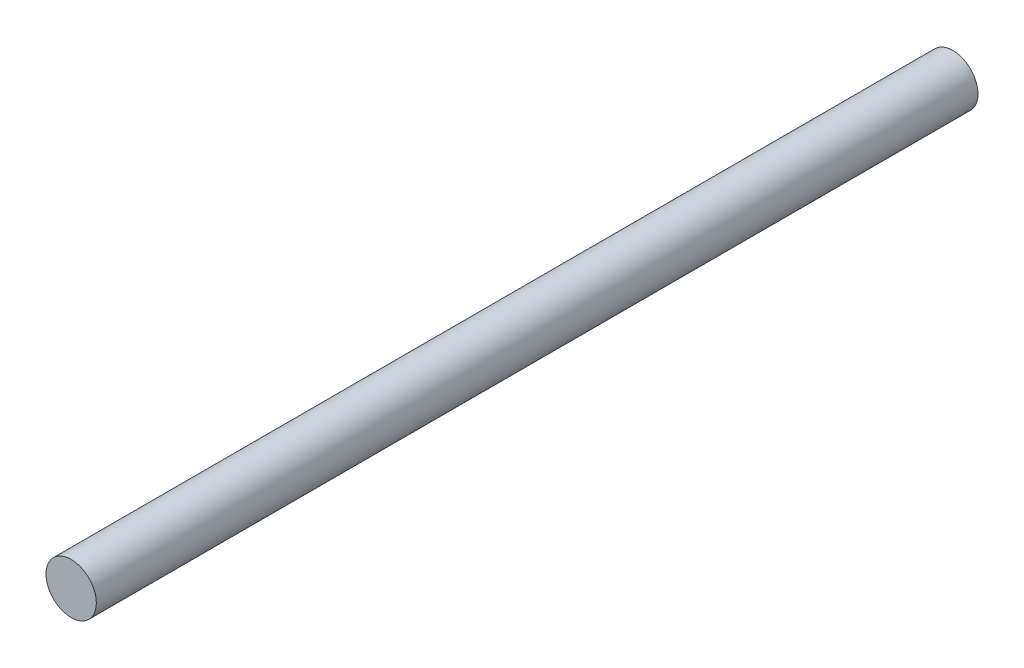
ISO-10303-21;
HEADER;
FILE_DESCRIPTION(('STEP AP214'),'2;1');
FILE_NAME('part.step','',(''),(''),'','','');
FILE_SCHEMA(('AUTOMOTIVE_DESIGN { 1 0 10303 214 1 1 1 1 }'));
ENDSEC;
DATA;
#1=APPLICATION_CONTEXT('core data for automotive mechanical design processes');
#2=APPLICATION_PROTOCOL_DEFINITION('international standard','automotive_design',2000,#1);
#3=PRODUCT_CONTEXT('',#1,'mechanical');
#4=PRODUCT('Part','Part','',(#3));
#5=PRODUCT_RELATED_PRODUCT_CATEGORY('part','',(#4));
#6=PRODUCT_DEFINITION_FORMATION('','',#4);
#7=PRODUCT_DEFINITION_CONTEXT('part definition',#1,'design');
#8=PRODUCT_DEFINITION('design','',#6,#7);
#9=PRODUCT_DEFINITION_SHAPE('','',#8);
#10=(LENGTH_UNIT() NAMED_UNIT(*) SI_UNIT(.MILLI.,.METRE.));
#11=(NAMED_UNIT(*) PLANE_ANGLE_UNIT() SI_UNIT($,.RADIAN.));
#12=(NAMED_UNIT(*) SI_UNIT($,.STERADIAN.) SOLID_ANGLE_UNIT());
#13=UNCERTAINTY_MEASURE_WITH_UNIT(LENGTH_MEASURE(1.E-05),#10,'distance_accuracy_value','');
#14=(GEOMETRIC_REPRESENTATION_CONTEXT(3) GLOBAL_UNCERTAINTY_ASSIGNED_CONTEXT((#13)) GLOBAL_UNIT_ASSIGNED_CONTEXT((#10,
#11,#12)) REPRESENTATION_CONTEXT('',''));
#15=CARTESIAN_POINT('',(0.,0.,0.));
#16=DIRECTION('',(0.,0.,1.));
#17=DIRECTION('',(1.,0.,0.));
#18=AXIS2_PLACEMENT_3D('',#15,#16,#17);
#19=CARTESIAN_POINT('',(0.,0.,35.));
#20=DIRECTION('',(0.,0.,-1.));
#21=DIRECTION('',(-1.,0.,0.));
#22=AXIS2_PLACEMENT_3D('',#19,#20,#21);
#23=CYLINDRICAL_SURFACE('',#22,1.);
#24=CARTESIAN_POINT('',(0.,0.,35.));
#25=DIRECTION('',(0.,0.,1.));
#26=DIRECTION('',(1.,0.,0.));
#27=AXIS2_PLACEMENT_3D('',#24,#25,#26);
#28=CIRCLE('',#27,1.);
#29=CARTESIAN_POINT('',(1.,0.,35.));
#30=VERTEX_POINT('',#29);
#31=EDGE_CURVE('E10',#30,#30,#28,.T.);
#32=ORIENTED_EDGE('',*,*,#31,.F.);
#33=EDGE_LOOP('',(#32));
#34=FACE_BOUND('',#33,.T.);
#35=CARTESIAN_POINT('',(0.,0.,0.));
#36=DIRECTION('',(0.,0.,1.));
#37=DIRECTION('',(1.,0.,0.));
#38=AXIS2_PLACEMENT_3D('',#35,#36,#37);
#39=CIRCLE('',#38,1.);
#40=CARTESIAN_POINT('',(1.,0.,0.));
#41=VERTEX_POINT('',#40);
#42=EDGE_CURVE('E40',#41,#41,#39,.T.);
#43=ORIENTED_EDGE('',*,*,#42,.T.);
#44=EDGE_LOOP('',(#43));
#45=FACE_BOUND('',#44,.T.);
#46=ADVANCED_FACE('F37',(#34,#45),#23,.T.);
#47=CARTESIAN_POINT('',(0.,0.,35.));
#48=DIRECTION('',(0.,0.,1.));
#49=DIRECTION('',(1.,0.,0.));
#50=AXIS2_PLACEMENT_3D('',#47,#48,#49);
#51=PLANE('',#50);
#52=ORIENTED_EDGE('',*,*,#31,.T.);
#53=EDGE_LOOP('',(#52));
#54=FACE_BOUND('',#53,.T.);
#55=ADVANCED_FACE('F52',(#54),#51,.T.);
#56=CARTESIAN_POINT('',(0.,0.,0.));
#57=DIRECTION('',(0.,0.,1.));
#58=DIRECTION('',(1.,0.,0.));
#59=AXIS2_PLACEMENT_3D('',#56,#57,#58);
#60=PLANE('',#59);
#61=ORIENTED_EDGE('',*,*,#42,.F.);
#62=EDGE_LOOP('',(#61));
#63=FACE_BOUND('',#62,.T.);
#64=ADVANCED_FACE('F50',(#63),#60,.F.);
#65=CLOSED_SHELL('',(#46,#55,#64));
#66=MANIFOLD_SOLID_BREP('B2',#65);
#67=ADVANCED_BREP_SHAPE_REPRESENTATION('',(#18,#66),#14);
#68=SHAPE_DEFINITION_REPRESENTATION(#9,#67);
ENDSEC;
END-ISO-10303-21;
